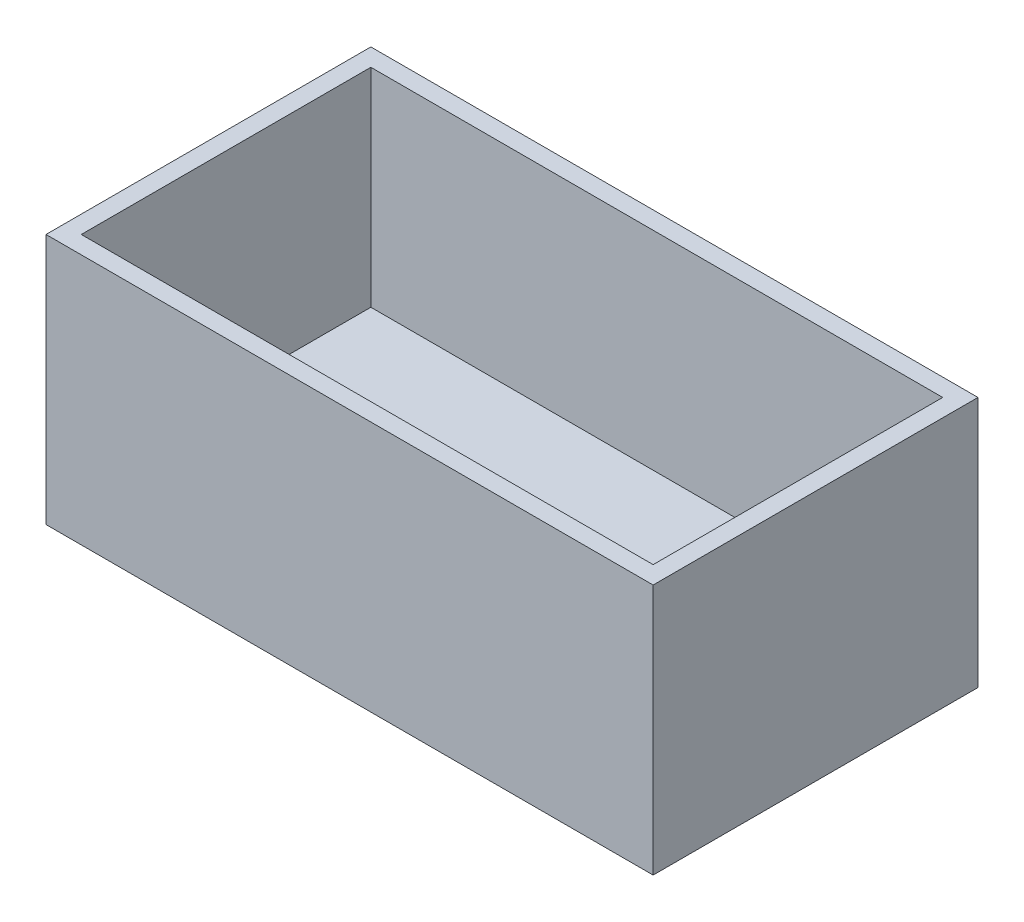
ISO-10303-21;
HEADER;
FILE_DESCRIPTION(('STEP AP214'),'2;1');
FILE_NAME('part.step','',(''),(''),'','','');
FILE_SCHEMA(('AUTOMOTIVE_DESIGN { 1 0 10303 214 1 1 1 1 }'));
ENDSEC;
DATA;
#1=APPLICATION_CONTEXT('core data for automotive mechanical design processes');
#2=APPLICATION_PROTOCOL_DEFINITION('international standard','automotive_design',2000,#1);
#3=PRODUCT_CONTEXT('',#1,'mechanical');
#4=PRODUCT('Part','Part','',(#3));
#5=PRODUCT_RELATED_PRODUCT_CATEGORY('part','',(#4));
#6=PRODUCT_DEFINITION_FORMATION('','',#4);
#7=PRODUCT_DEFINITION_CONTEXT('part definition',#1,'design');
#8=PRODUCT_DEFINITION('design','',#6,#7);
#9=PRODUCT_DEFINITION_SHAPE('','',#8);
#10=(LENGTH_UNIT() NAMED_UNIT(*) SI_UNIT(.MILLI.,.METRE.));
#11=(NAMED_UNIT(*) PLANE_ANGLE_UNIT() SI_UNIT($,.RADIAN.));
#12=(NAMED_UNIT(*) SI_UNIT($,.STERADIAN.) SOLID_ANGLE_UNIT());
#13=UNCERTAINTY_MEASURE_WITH_UNIT(LENGTH_MEASURE(1.E-05),#10,'distance_accuracy_value','');
#14=(GEOMETRIC_REPRESENTATION_CONTEXT(3) GLOBAL_UNCERTAINTY_ASSIGNED_CONTEXT((#13)) GLOBAL_UNIT_ASSIGNED_CONTEXT((#10,
#11,#12)) REPRESENTATION_CONTEXT('',''));
#15=CARTESIAN_POINT('',(0.,0.,0.));
#16=DIRECTION('',(0.,0.,1.));
#17=DIRECTION('',(1.,0.,0.));
#18=AXIS2_PLACEMENT_3D('',#15,#16,#17);
#19=CARTESIAN_POINT('',(655.574,542.544,350.774));
#20=DIRECTION('',(-1.,0.,0.));
#21=DIRECTION('',(0.,0.,1.));
#22=AXIS2_PLACEMENT_3D('',#19,#20,#21);
#23=PLANE('',#22);
#24=DIRECTION('',(0.,0.,-1.));
#25=VECTOR('',#24,1.);
#26=CARTESIAN_POINT('',(655.574,0.,350.774));
#27=LINE('',#26,#25);
#28=CARTESIAN_POINT('',(655.574,0.,350.774));
#29=VERTEX_POINT('',#28);
#30=CARTESIAN_POINT('',(655.574,0.,-350.774));
#31=VERTEX_POINT('',#30);
#32=EDGE_CURVE('E171',#29,#31,#27,.T.);
#33=ORIENTED_EDGE('',*,*,#32,.T.);
#34=DIRECTION('',(0.,-1.,0.));
#35=VECTOR('',#34,1.);
#36=CARTESIAN_POINT('',(655.574,542.544,-350.774));
#37=LINE('',#36,#35);
#38=CARTESIAN_POINT('',(655.574,542.544,-350.774));
#39=VERTEX_POINT('',#38);
#40=EDGE_CURVE('E11',#39,#31,#37,.T.);
#41=ORIENTED_EDGE('',*,*,#40,.F.);
#42=DIRECTION('',(0.,0.,-1.));
#43=VECTOR('',#42,1.);
#44=CARTESIAN_POINT('',(655.574,542.544,350.774));
#45=LINE('',#44,#43);
#46=CARTESIAN_POINT('',(655.574,542.544,350.774));
#47=VERTEX_POINT('',#46);
#48=EDGE_CURVE('E177',#47,#39,#45,.T.);
#49=ORIENTED_EDGE('',*,*,#48,.F.);
#50=DIRECTION('',(0.,-1.,0.));
#51=VECTOR('',#50,1.);
#52=CARTESIAN_POINT('',(655.574,542.544,350.774));
#53=LINE('',#52,#51);
#54=EDGE_CURVE('E70',#47,#29,#53,.T.);
#55=ORIENTED_EDGE('',*,*,#54,.T.);
#56=EDGE_LOOP('',(#33,#41,#49,#55));
#57=FACE_BOUND('',#56,.T.);
#58=ADVANCED_FACE('F42',(#57),#23,.F.);
#59=CARTESIAN_POINT('',(655.574,542.544,-350.774));
#60=DIRECTION('',(0.,0.,1.));
#61=DIRECTION('',(1.,0.,0.));
#62=AXIS2_PLACEMENT_3D('',#59,#60,#61);
#63=PLANE('',#62);
#64=DIRECTION('',(-1.,0.,0.));
#65=VECTOR('',#64,1.);
#66=CARTESIAN_POINT('',(655.574,0.,-350.774));
#67=LINE('',#66,#65);
#68=CARTESIAN_POINT('',(-655.574,0.,-350.774));
#69=VERTEX_POINT('',#68);
#70=EDGE_CURVE('E192',#31,#69,#67,.T.);
#71=ORIENTED_EDGE('',*,*,#70,.T.);
#72=DIRECTION('',(0.,-1.,0.));
#73=VECTOR('',#72,1.);
#74=CARTESIAN_POINT('',(-655.574,542.544,-350.774));
#75=LINE('',#74,#73);
#76=CARTESIAN_POINT('',(-655.574,542.544,-350.774));
#77=VERTEX_POINT('',#76);
#78=EDGE_CURVE('E50',#77,#69,#75,.T.);
#79=ORIENTED_EDGE('',*,*,#78,.F.);
#80=DIRECTION('',(-1.,0.,0.));
#81=VECTOR('',#80,1.);
#82=CARTESIAN_POINT('',(655.574,542.544,-350.774));
#83=LINE('',#82,#81);
#84=EDGE_CURVE('E102',#39,#77,#83,.T.);
#85=ORIENTED_EDGE('',*,*,#84,.F.);
#86=ORIENTED_EDGE('',*,*,#40,.T.);
#87=EDGE_LOOP('',(#71,#79,#85,#86));
#88=FACE_BOUND('',#87,.T.);
#89=ADVANCED_FACE('F209',(#88),#63,.F.);
#90=CARTESIAN_POINT('',(-655.574,542.544,350.774));
#91=DIRECTION('',(-1.,0.,0.));
#92=DIRECTION('',(0.,0.,1.));
#93=AXIS2_PLACEMENT_3D('',#90,#91,#92);
#94=PLANE('',#93);
#95=DIRECTION('',(0.,0.,-1.));
#96=VECTOR('',#95,1.);
#97=CARTESIAN_POINT('',(-655.574,0.,350.774));
#98=LINE('',#97,#96);
#99=CARTESIAN_POINT('',(-655.574,0.,350.774));
#100=VERTEX_POINT('',#99);
#101=EDGE_CURVE('E195',#100,#69,#98,.T.);
#102=ORIENTED_EDGE('',*,*,#101,.F.);
#103=DIRECTION('',(0.,-1.,0.));
#104=VECTOR('',#103,1.);
#105=CARTESIAN_POINT('',(-655.574,542.544,350.774));
#106=LINE('',#105,#104);
#107=CARTESIAN_POINT('',(-655.574,542.544,350.774));
#108=VERTEX_POINT('',#107);
#109=EDGE_CURVE('E203',#108,#100,#106,.T.);
#110=ORIENTED_EDGE('',*,*,#109,.F.);
#111=DIRECTION('',(0.,0.,-1.));
#112=VECTOR('',#111,1.);
#113=CARTESIAN_POINT('',(-655.574,542.544,350.774));
#114=LINE('',#113,#112);
#115=EDGE_CURVE('E183',#108,#77,#114,.T.);
#116=ORIENTED_EDGE('',*,*,#115,.T.);
#117=ORIENTED_EDGE('',*,*,#78,.T.);
#118=EDGE_LOOP('',(#102,#110,#116,#117));
#119=FACE_BOUND('',#118,.T.);
#120=ADVANCED_FACE('F207',(#119),#94,.T.);
#121=CARTESIAN_POINT('',(655.574,542.544,350.774));
#122=DIRECTION('',(0.,0.,1.));
#123=DIRECTION('',(1.,0.,0.));
#124=AXIS2_PLACEMENT_3D('',#121,#122,#123);
#125=PLANE('',#124);
#126=DIRECTION('',(-1.,0.,0.));
#127=VECTOR('',#126,1.);
#128=CARTESIAN_POINT('',(655.574,0.,350.774));
#129=LINE('',#128,#127);
#130=EDGE_CURVE('E180',#29,#100,#129,.T.);
#131=ORIENTED_EDGE('',*,*,#130,.F.);
#132=ORIENTED_EDGE('',*,*,#54,.F.);
#133=DIRECTION('',(-1.,0.,0.));
#134=VECTOR('',#133,1.);
#135=CARTESIAN_POINT('',(655.574,542.544,350.774));
#136=LINE('',#135,#134);
#137=EDGE_CURVE('E187',#47,#108,#136,.T.);
#138=ORIENTED_EDGE('',*,*,#137,.T.);
#139=ORIENTED_EDGE('',*,*,#109,.T.);
#140=EDGE_LOOP('',(#131,#132,#138,#139));
#141=FACE_BOUND('',#140,.T.);
#142=ADVANCED_FACE('F213',(#141),#125,.T.);
#143=CARTESIAN_POINT('',(0.,542.544,0.));
#144=DIRECTION('',(0.,1.,0.));
#145=DIRECTION('',(0.,0.,1.));
#146=AXIS2_PLACEMENT_3D('',#143,#144,#145);
#147=PLANE('',#146);
#148=DIRECTION('',(0.,0.,1.));
#149=VECTOR('',#148,1.);
#150=CARTESIAN_POINT('',(-617.474,542.544,0.));
#151=LINE('',#150,#149);
#152=CARTESIAN_POINT('',(-617.474,542.544,-312.674));
#153=VERTEX_POINT('',#152);
#154=CARTESIAN_POINT('',(-617.474,542.544,312.674));
#155=VERTEX_POINT('',#154);
#156=EDGE_CURVE('E60',#153,#155,#151,.T.);
#157=ORIENTED_EDGE('',*,*,#156,.F.);
#158=DIRECTION('',(1.,0.,0.));
#159=VECTOR('',#158,1.);
#160=CARTESIAN_POINT('',(0.,542.544,-312.674));
#161=LINE('',#160,#159);
#162=CARTESIAN_POINT('',(617.474,542.544,-312.674));
#163=VERTEX_POINT('',#162);
#164=EDGE_CURVE('E148',#153,#163,#161,.T.);
#165=ORIENTED_EDGE('',*,*,#164,.T.);
#166=DIRECTION('',(0.,0.,1.));
#167=VECTOR('',#166,1.);
#168=CARTESIAN_POINT('',(617.474,542.544,1.09624377451818E-13));
#169=LINE('',#168,#167);
#170=CARTESIAN_POINT('',(617.474,542.544,312.674));
#171=VERTEX_POINT('',#170);
#172=EDGE_CURVE('E154',#163,#171,#169,.T.);
#173=ORIENTED_EDGE('',*,*,#172,.T.);
#174=DIRECTION('',(1.,0.,0.));
#175=VECTOR('',#174,1.);
#176=CARTESIAN_POINT('',(0.,542.544,312.674));
#177=LINE('',#176,#175);
#178=EDGE_CURVE('E163',#155,#171,#177,.T.);
#179=ORIENTED_EDGE('',*,*,#178,.F.);
#180=EDGE_LOOP('',(#157,#165,#173,#179));
#181=FACE_BOUND('',#180,.T.);
#182=ORIENTED_EDGE('',*,*,#48,.T.);
#183=ORIENTED_EDGE('',*,*,#84,.T.);
#184=ORIENTED_EDGE('',*,*,#115,.F.);
#185=ORIENTED_EDGE('',*,*,#137,.F.);
#186=EDGE_LOOP('',(#182,#183,#184,#185));
#187=FACE_BOUND('',#186,.T.);
#188=ADVANCED_FACE('F216',(#181,#187),#147,.T.);
#189=CARTESIAN_POINT('',(0.,0.,0.));
#190=DIRECTION('',(0.,1.,0.));
#191=DIRECTION('',(0.,0.,1.));
#192=AXIS2_PLACEMENT_3D('',#189,#190,#191);
#193=PLANE('',#192);
#194=ORIENTED_EDGE('',*,*,#32,.F.);
#195=ORIENTED_EDGE('',*,*,#130,.T.);
#196=ORIENTED_EDGE('',*,*,#101,.T.);
#197=ORIENTED_EDGE('',*,*,#70,.F.);
#198=EDGE_LOOP('',(#194,#195,#196,#197));
#199=FACE_BOUND('',#198,.T.);
#200=ADVANCED_FACE('F212',(#199),#193,.F.);
#201=CARTESIAN_POINT('',(-617.474,93.7259999999999,0.));
#202=DIRECTION('',(-1.,0.,0.));
#203=DIRECTION('',(0.,0.,1.));
#204=AXIS2_PLACEMENT_3D('',#201,#202,#203);
#205=PLANE('',#204);
#206=ORIENTED_EDGE('',*,*,#156,.T.);
#207=DIRECTION('',(0.,1.,0.));
#208=VECTOR('',#207,1.);
#209=CARTESIAN_POINT('',(-617.474,93.7259999999999,312.674));
#210=LINE('',#209,#208);
#211=CARTESIAN_POINT('',(-617.474,93.7259999999999,312.674));
#212=VERTEX_POINT('',#211);
#213=EDGE_CURVE('E124',#212,#155,#210,.T.);
#214=ORIENTED_EDGE('',*,*,#213,.F.);
#215=DIRECTION('',(0.,0.,1.));
#216=VECTOR('',#215,1.);
#217=CARTESIAN_POINT('',(-617.474,93.7259999999999,0.));
#218=LINE('',#217,#216);
#219=CARTESIAN_POINT('',(-617.474,93.7259999999999,-312.674));
#220=VERTEX_POINT('',#219);
#221=EDGE_CURVE('E128',#220,#212,#218,.T.);
#222=ORIENTED_EDGE('',*,*,#221,.F.);
#223=DIRECTION('',(0.,1.,0.));
#224=VECTOR('',#223,1.);
#225=CARTESIAN_POINT('',(-617.474,93.7259999999999,-312.674));
#226=LINE('',#225,#224);
#227=EDGE_CURVE('E169',#220,#153,#226,.T.);
#228=ORIENTED_EDGE('',*,*,#227,.T.);
#229=EDGE_LOOP('',(#206,#214,#222,#228));
#230=FACE_BOUND('',#229,.T.);
#231=ADVANCED_FACE('F126',(#230),#205,.F.);
#232=CARTESIAN_POINT('',(0.,93.7259999999999,-312.674));
#233=DIRECTION('',(0.,0.,1.));
#234=DIRECTION('',(1.,0.,0.));
#235=AXIS2_PLACEMENT_3D('',#232,#233,#234);
#236=PLANE('',#235);
#237=ORIENTED_EDGE('',*,*,#164,.F.);
#238=ORIENTED_EDGE('',*,*,#227,.F.);
#239=DIRECTION('',(1.,0.,0.));
#240=VECTOR('',#239,1.);
#241=CARTESIAN_POINT('',(0.,93.7259999999999,-312.674));
#242=LINE('',#241,#240);
#243=CARTESIAN_POINT('',(617.474,93.7259999999999,-312.674));
#244=VERTEX_POINT('',#243);
#245=EDGE_CURVE('E134',#220,#244,#242,.T.);
#246=ORIENTED_EDGE('',*,*,#245,.T.);
#247=DIRECTION('',(0.,1.,0.));
#248=VECTOR('',#247,1.);
#249=CARTESIAN_POINT('',(617.474,93.7259999999999,-312.674));
#250=LINE('',#249,#248);
#251=EDGE_CURVE('E172',#244,#163,#250,.T.);
#252=ORIENTED_EDGE('',*,*,#251,.T.);
#253=EDGE_LOOP('',(#237,#238,#246,#252));
#254=FACE_BOUND('',#253,.T.);
#255=ADVANCED_FACE('F235',(#254),#236,.T.);
#256=CARTESIAN_POINT('',(617.474,93.7259999999999,1.09624377451818E-13));
#257=DIRECTION('',(-1.,0.,0.));
#258=DIRECTION('',(0.,0.,1.));
#259=AXIS2_PLACEMENT_3D('',#256,#257,#258);
#260=PLANE('',#259);
#261=ORIENTED_EDGE('',*,*,#172,.F.);
#262=ORIENTED_EDGE('',*,*,#251,.F.);
#263=DIRECTION('',(0.,0.,1.));
#264=VECTOR('',#263,1.);
#265=CARTESIAN_POINT('',(617.474,93.7259999999999,1.09624377451818E-13));
#266=LINE('',#265,#264);
#267=CARTESIAN_POINT('',(617.474,93.7259999999999,312.674));
#268=VERTEX_POINT('',#267);
#269=EDGE_CURVE('E143',#244,#268,#266,.T.);
#270=ORIENTED_EDGE('',*,*,#269,.T.);
#271=DIRECTION('',(0.,1.,0.));
#272=VECTOR('',#271,1.);
#273=CARTESIAN_POINT('',(617.474,93.7259999999999,312.674));
#274=LINE('',#273,#272);
#275=EDGE_CURVE('E133',#268,#171,#274,.T.);
#276=ORIENTED_EDGE('',*,*,#275,.T.);
#277=EDGE_LOOP('',(#261,#262,#270,#276));
#278=FACE_BOUND('',#277,.T.);
#279=ADVANCED_FACE('F238',(#278),#260,.T.);
#280=CARTESIAN_POINT('',(0.,93.7259999999999,312.674));
#281=DIRECTION('',(0.,0.,1.));
#282=DIRECTION('',(1.,0.,0.));
#283=AXIS2_PLACEMENT_3D('',#280,#281,#282);
#284=PLANE('',#283);
#285=ORIENTED_EDGE('',*,*,#178,.T.);
#286=ORIENTED_EDGE('',*,*,#275,.F.);
#287=DIRECTION('',(1.,0.,0.));
#288=VECTOR('',#287,1.);
#289=CARTESIAN_POINT('',(0.,93.7259999999999,312.674));
#290=LINE('',#289,#288);
#291=EDGE_CURVE('E138',#212,#268,#290,.T.);
#292=ORIENTED_EDGE('',*,*,#291,.F.);
#293=ORIENTED_EDGE('',*,*,#213,.T.);
#294=EDGE_LOOP('',(#285,#286,#292,#293));
#295=FACE_BOUND('',#294,.T.);
#296=ADVANCED_FACE('F139',(#295),#284,.F.);
#297=CARTESIAN_POINT('',(0.,93.7259999999999,0.));
#298=DIRECTION('',(0.,1.,0.));
#299=DIRECTION('',(0.,0.,1.));
#300=AXIS2_PLACEMENT_3D('',#297,#298,#299);
#301=PLANE('',#300);
#302=ORIENTED_EDGE('',*,*,#221,.T.);
#303=ORIENTED_EDGE('',*,*,#291,.T.);
#304=ORIENTED_EDGE('',*,*,#269,.F.);
#305=ORIENTED_EDGE('',*,*,#245,.F.);
#306=EDGE_LOOP('',(#302,#303,#304,#305));
#307=FACE_BOUND('',#306,.T.);
#308=ADVANCED_FACE('F146',(#307),#301,.T.);
#309=CLOSED_SHELL('',(#58,#89,#120,#142,#188,#200,#231,#255,#279,#296,#308));
#310=MANIFOLD_SOLID_BREP('B2',#309);
#311=ADVANCED_BREP_SHAPE_REPRESENTATION('',(#18,#310),#14);
#312=SHAPE_DEFINITION_REPRESENTATION(#9,#311);
ENDSEC;
END-ISO-10303-21;
